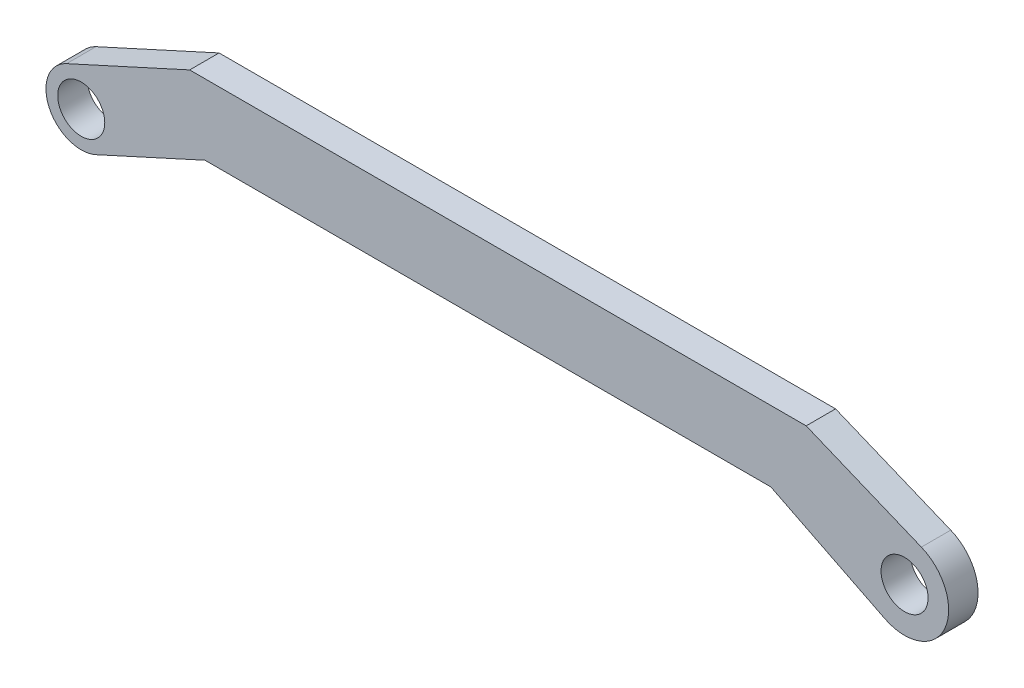
ISO-10303-21;
HEADER;
FILE_DESCRIPTION(('STEP AP214'),'2;1');
FILE_NAME('part.step','',(''),(''),'','','');
FILE_SCHEMA(('AUTOMOTIVE_DESIGN { 1 0 10303 214 1 1 1 1 }'));
ENDSEC;
DATA;
#1=APPLICATION_CONTEXT('core data for automotive mechanical design processes');
#2=APPLICATION_PROTOCOL_DEFINITION('international standard','automotive_design',2000,#1);
#3=PRODUCT_CONTEXT('',#1,'mechanical');
#4=PRODUCT('Part','Part','',(#3));
#5=PRODUCT_RELATED_PRODUCT_CATEGORY('part','',(#4));
#6=PRODUCT_DEFINITION_FORMATION('','',#4);
#7=PRODUCT_DEFINITION_CONTEXT('part definition',#1,'design');
#8=PRODUCT_DEFINITION('design','',#6,#7);
#9=PRODUCT_DEFINITION_SHAPE('','',#8);
#10=(LENGTH_UNIT() NAMED_UNIT(*) SI_UNIT(.MILLI.,.METRE.));
#11=(NAMED_UNIT(*) PLANE_ANGLE_UNIT() SI_UNIT($,.RADIAN.));
#12=(NAMED_UNIT(*) SI_UNIT($,.STERADIAN.) SOLID_ANGLE_UNIT());
#13=UNCERTAINTY_MEASURE_WITH_UNIT(LENGTH_MEASURE(1.E-05),#10,'distance_accuracy_value','');
#14=(GEOMETRIC_REPRESENTATION_CONTEXT(3) GLOBAL_UNCERTAINTY_ASSIGNED_CONTEXT((#13)) GLOBAL_UNIT_ASSIGNED_CONTEXT((#10,
#11,#12)) REPRESENTATION_CONTEXT('',''));
#15=CARTESIAN_POINT('',(0.,0.,0.));
#16=DIRECTION('',(0.,0.,1.));
#17=DIRECTION('',(1.,0.,0.));
#18=AXIS2_PLACEMENT_3D('',#15,#16,#17);
#19=CARTESIAN_POINT('',(-2.48874202337485,5.45950209644507,5.));
#20=DIRECTION('',(0.414790337229141,-0.909917016074178,0.));
#21=DIRECTION('',(0.909917016074178,0.414790337229141,0.));
#22=AXIS2_PLACEMENT_3D('',#19,#20,#21);
#23=PLANE('',#22);
#24=DIRECTION('',(-0.909917016074178,-0.414790337229141,0.));
#25=VECTOR('',#24,1.);
#26=CARTESIAN_POINT('',(-2.48874202337485,5.45950209644507,0.));
#27=LINE('',#26,#25);
#28=CARTESIAN_POINT('',(18.4400516468331,15.,0.));
#29=VERTEX_POINT('',#28);
#30=CARTESIAN_POINT('',(-2.48874202337484,5.45950209644507,0.));
#31=VERTEX_POINT('',#30);
#32=EDGE_CURVE('E138',#29,#31,#27,.T.);
#33=ORIENTED_EDGE('',*,*,#32,.T.);
#34=DIRECTION('',(0.,0.,-1.));
#35=VECTOR('',#34,1.);
#36=CARTESIAN_POINT('',(-2.48874202337484,5.45950209644507,5.));
#37=LINE('',#36,#35);
#38=CARTESIAN_POINT('',(-2.48874202337484,5.45950209644507,5.));
#39=VERTEX_POINT('',#38);
#40=EDGE_CURVE('E11',#39,#31,#37,.T.);
#41=ORIENTED_EDGE('',*,*,#40,.F.);
#42=DIRECTION('',(-0.909917016074178,-0.414790337229141,0.));
#43=VECTOR('',#42,1.);
#44=CARTESIAN_POINT('',(-2.48874202337485,5.45950209644507,5.));
#45=LINE('',#44,#43);
#46=CARTESIAN_POINT('',(18.4400516468331,15.,5.));
#47=VERTEX_POINT('',#46);
#48=EDGE_CURVE('E187',#47,#39,#45,.T.);
#49=ORIENTED_EDGE('',*,*,#48,.F.);
#50=DIRECTION('',(0.,0.,-1.));
#51=VECTOR('',#50,1.);
#52=CARTESIAN_POINT('',(18.4400516468331,15.,5.));
#53=LINE('',#52,#51);
#54=EDGE_CURVE('E51',#47,#29,#53,.T.);
#55=ORIENTED_EDGE('',*,*,#54,.T.);
#56=EDGE_LOOP('',(#33,#41,#49,#55));
#57=FACE_BOUND('',#56,.T.);
#58=ADVANCED_FACE('F34',(#57),#23,.F.);
#59=CARTESIAN_POINT('',(0.,0.,5.));
#60=DIRECTION('',(0.,0.,-1.));
#61=DIRECTION('',(-1.,0.,0.));
#62=AXIS2_PLACEMENT_3D('',#59,#60,#61);
#63=CYLINDRICAL_SURFACE('',#62,6.);
#64=CARTESIAN_POINT('',(0.,0.,0.));
#65=DIRECTION('',(0.,0.,1.));
#66=DIRECTION('',(1.,0.,0.));
#67=AXIS2_PLACEMENT_3D('',#64,#65,#66);
#68=CIRCLE('',#67,6.);
#69=CARTESIAN_POINT('',(2.48874202337485,-5.45950209644506,0.));
#70=VERTEX_POINT('',#69);
#71=EDGE_CURVE('E140',#31,#70,#68,.T.);
#72=ORIENTED_EDGE('',*,*,#71,.T.);
#73=DIRECTION('',(0.,0.,-1.));
#74=VECTOR('',#73,1.);
#75=CARTESIAN_POINT('',(2.48874202337485,-5.45950209644506,5.));
#76=LINE('',#75,#74);
#77=CARTESIAN_POINT('',(2.48874202337485,-5.45950209644506,5.));
#78=VERTEX_POINT('',#77);
#79=EDGE_CURVE('E43',#78,#70,#76,.T.);
#80=ORIENTED_EDGE('',*,*,#79,.F.);
#81=CARTESIAN_POINT('',(0.,0.,5.));
#82=DIRECTION('',(0.,0.,1.));
#83=DIRECTION('',(1.,0.,0.));
#84=AXIS2_PLACEMENT_3D('',#81,#82,#83);
#85=CIRCLE('',#84,6.);
#86=EDGE_CURVE('E89',#39,#78,#85,.T.);
#87=ORIENTED_EDGE('',*,*,#86,.F.);
#88=ORIENTED_EDGE('',*,*,#40,.T.);
#89=EDGE_LOOP('',(#72,#80,#87,#88));
#90=FACE_BOUND('',#89,.T.);
#91=ADVANCED_FACE('F170',(#90),#63,.T.);
#92=CARTESIAN_POINT('',(2.48874202337484,-5.45950209644506,5.));
#93=DIRECTION('',(0.414790337229141,-0.909917016074178,0.));
#94=DIRECTION('',(0.909917016074178,0.414790337229141,0.));
#95=AXIS2_PLACEMENT_3D('',#92,#93,#94);
#96=PLANE('',#95);
#97=DIRECTION('',(-0.909917016074178,-0.414790337229141,0.));
#98=VECTOR('',#97,1.);
#99=CARTESIAN_POINT('',(2.48874202337484,-5.45950209644506,0.));
#100=LINE('',#99,#98);
#101=CARTESIAN_POINT('',(21.0461774653154,3.,0.));
#102=VERTEX_POINT('',#101);
#103=EDGE_CURVE('E143',#102,#70,#100,.T.);
#104=ORIENTED_EDGE('',*,*,#103,.F.);
#105=DIRECTION('',(0.,0.,-1.));
#106=VECTOR('',#105,1.);
#107=CARTESIAN_POINT('',(21.0461774653154,3.,5.));
#108=LINE('',#107,#106);
#109=CARTESIAN_POINT('',(21.0461774653154,3.,5.));
#110=VERTEX_POINT('',#109);
#111=EDGE_CURVE('E163',#110,#102,#108,.T.);
#112=ORIENTED_EDGE('',*,*,#111,.F.);
#113=DIRECTION('',(-0.909917016074178,-0.414790337229141,0.));
#114=VECTOR('',#113,1.);
#115=CARTESIAN_POINT('',(2.48874202337484,-5.45950209644506,5.));
#116=LINE('',#115,#114);
#117=EDGE_CURVE('E169',#110,#78,#116,.T.);
#118=ORIENTED_EDGE('',*,*,#117,.T.);
#119=ORIENTED_EDGE('',*,*,#79,.T.);
#120=EDGE_LOOP('',(#104,#112,#118,#119));
#121=FACE_BOUND('',#120,.T.);
#122=ADVANCED_FACE('F167',(#121),#96,.T.);
#123=CARTESIAN_POINT('',(0.,3.,5.));
#124=DIRECTION('',(0.,1.,0.));
#125=DIRECTION('',(0.,0.,1.));
#126=AXIS2_PLACEMENT_3D('',#123,#124,#125);
#127=PLANE('',#126);
#128=DIRECTION('',(1.,0.,0.));
#129=VECTOR('',#128,1.);
#130=CARTESIAN_POINT('',(0.,3.,0.));
#131=LINE('',#130,#129);
#132=CARTESIAN_POINT('',(117.260230362543,2.99999999999999,0.));
#133=VERTEX_POINT('',#132);
#134=EDGE_CURVE('E146',#102,#133,#131,.T.);
#135=ORIENTED_EDGE('',*,*,#134,.T.);
#136=DIRECTION('',(0.,0.,-1.));
#137=VECTOR('',#136,1.);
#138=CARTESIAN_POINT('',(117.260230362543,2.99999999999999,5.));
#139=LINE('',#138,#137);
#140=CARTESIAN_POINT('',(117.260230362543,2.99999999999999,5.));
#141=VERTEX_POINT('',#140);
#142=EDGE_CURVE('E160',#141,#133,#139,.T.);
#143=ORIENTED_EDGE('',*,*,#142,.F.);
#144=DIRECTION('',(1.,0.,0.));
#145=VECTOR('',#144,1.);
#146=CARTESIAN_POINT('',(0.,3.,5.));
#147=LINE('',#146,#145);
#148=EDGE_CURVE('E182',#110,#141,#147,.T.);
#149=ORIENTED_EDGE('',*,*,#148,.F.);
#150=ORIENTED_EDGE('',*,*,#111,.T.);
#151=EDGE_LOOP('',(#135,#143,#149,#150));
#152=FACE_BOUND('',#151,.T.);
#153=ADVANCED_FACE('F178',(#152),#127,.F.);
#154=CARTESIAN_POINT('',(24.7127038317791,49.3471484366467,5.));
#155=DIRECTION('',(0.447780711374673,0.894143408252162,0.));
#156=DIRECTION('',(-0.894143408252162,0.447780711374673,0.));
#157=AXIS2_PLACEMENT_3D('',#154,#155,#156);
#158=PLANE('',#157);
#159=DIRECTION('',(0.894143408252162,-0.447780711374673,0.));
#160=VECTOR('',#159,1.);
#161=CARTESIAN_POINT('',(24.7127038317791,49.3471484366467,0.));
#162=LINE('',#161,#160);
#163=CARTESIAN_POINT('',(136.64164466469,-6.70607556189121,0.));
#164=VERTEX_POINT('',#163);
#165=EDGE_CURVE('E148',#133,#164,#162,.T.);
#166=ORIENTED_EDGE('',*,*,#165,.T.);
#167=DIRECTION('',(0.,0.,-1.));
#168=VECTOR('',#167,1.);
#169=CARTESIAN_POINT('',(136.64164466469,-6.70607556189121,5.));
#170=LINE('',#169,#168);
#171=CARTESIAN_POINT('',(136.64164466469,-6.70607556189121,5.));
#172=VERTEX_POINT('',#171);
#173=EDGE_CURVE('E124',#172,#164,#170,.T.);
#174=ORIENTED_EDGE('',*,*,#173,.F.);
#175=DIRECTION('',(0.894143408252162,-0.447780711374673,0.));
#176=VECTOR('',#175,1.);
#177=CARTESIAN_POINT('',(24.7127038317791,49.3471484366467,5.));
#178=LINE('',#177,#176);
#179=EDGE_CURVE('E112',#141,#172,#178,.T.);
#180=ORIENTED_EDGE('',*,*,#179,.F.);
#181=ORIENTED_EDGE('',*,*,#142,.T.);
#182=EDGE_LOOP('',(#166,#174,#180,#181));
#183=FACE_BOUND('',#182,.T.);
#184=ADVANCED_FACE('F181',(#183),#158,.F.);
#185=CARTESIAN_POINT('',(140.,0.,5.));
#186=DIRECTION('',(0.,0.,-1.));
#187=DIRECTION('',(-1.,0.,0.));
#188=AXIS2_PLACEMENT_3D('',#185,#186,#187);
#189=CYLINDRICAL_SURFACE('',#188,7.5);
#190=CARTESIAN_POINT('',(140.,0.,0.));
#191=DIRECTION('',(0.,0.,1.));
#192=DIRECTION('',(1.,0.,0.));
#193=AXIS2_PLACEMENT_3D('',#190,#191,#192);
#194=CIRCLE('',#193,7.5);
#195=CARTESIAN_POINT('',(142.855666239138,6.93506815616458,0.));
#196=VERTEX_POINT('',#195);
#197=EDGE_CURVE('E121',#164,#196,#194,.T.);
#198=ORIENTED_EDGE('',*,*,#197,.T.);
#199=DIRECTION('',(0.,0.,-1.));
#200=VECTOR('',#199,1.);
#201=CARTESIAN_POINT('',(142.855666239138,6.93506815616458,5.));
#202=LINE('',#201,#200);
#203=CARTESIAN_POINT('',(142.855666239138,6.93506815616458,5.));
#204=VERTEX_POINT('',#203);
#205=EDGE_CURVE('E118',#204,#196,#202,.T.);
#206=ORIENTED_EDGE('',*,*,#205,.F.);
#207=CARTESIAN_POINT('',(140.,0.,5.));
#208=DIRECTION('',(0.,0.,1.));
#209=DIRECTION('',(1.,0.,0.));
#210=AXIS2_PLACEMENT_3D('',#207,#208,#209);
#211=CIRCLE('',#210,7.5);
#212=EDGE_CURVE('E105',#172,#204,#211,.T.);
#213=ORIENTED_EDGE('',*,*,#212,.F.);
#214=ORIENTED_EDGE('',*,*,#173,.T.);
#215=EDGE_LOOP('',(#198,#206,#213,#214));
#216=FACE_BOUND('',#215,.T.);
#217=ADVANCED_FACE('F119',(#216),#189,.T.);
#218=CARTESIAN_POINT('',(23.1521311939702,56.2256210442564,5.));
#219=DIRECTION('',(0.380755498551726,0.924675754155275,0.));
#220=DIRECTION('',(-0.924675754155275,0.380755498551726,0.));
#221=AXIS2_PLACEMENT_3D('',#218,#219,#220);
#222=PLANE('',#221);
#223=DIRECTION('',(0.924675754155275,-0.380755498551726,0.));
#224=VECTOR('',#223,1.);
#225=CARTESIAN_POINT('',(23.1521311939702,56.2256210442564,0.));
#226=LINE('',#225,#224);
#227=CARTESIAN_POINT('',(123.269745711988,15.,0.));
#228=VERTEX_POINT('',#227);
#229=EDGE_CURVE('E151',#228,#196,#226,.T.);
#230=ORIENTED_EDGE('',*,*,#229,.F.);
#231=DIRECTION('',(0.,0.,-1.));
#232=VECTOR('',#231,1.);
#233=CARTESIAN_POINT('',(123.269745711988,15.,5.));
#234=LINE('',#233,#232);
#235=CARTESIAN_POINT('',(123.269745711988,15.,5.));
#236=VERTEX_POINT('',#235);
#237=EDGE_CURVE('E77',#236,#228,#234,.T.);
#238=ORIENTED_EDGE('',*,*,#237,.F.);
#239=DIRECTION('',(0.924675754155275,-0.380755498551726,0.));
#240=VECTOR('',#239,1.);
#241=CARTESIAN_POINT('',(23.1521311939702,56.2256210442564,5.));
#242=LINE('',#241,#240);
#243=EDGE_CURVE('E110',#236,#204,#242,.T.);
#244=ORIENTED_EDGE('',*,*,#243,.T.);
#245=ORIENTED_EDGE('',*,*,#205,.T.);
#246=EDGE_LOOP('',(#230,#238,#244,#245));
#247=FACE_BOUND('',#246,.T.);
#248=ADVANCED_FACE('F126',(#247),#222,.T.);
#249=CARTESIAN_POINT('',(140.,0.,5.));
#250=DIRECTION('',(0.,0.,-1.));
#251=DIRECTION('',(-1.,0.,0.));
#252=AXIS2_PLACEMENT_3D('',#249,#250,#251);
#253=CYLINDRICAL_SURFACE('',#252,3.99999999999999);
#254=CARTESIAN_POINT('',(140.,0.,5.));
#255=DIRECTION('',(0.,0.,1.));
#256=DIRECTION('',(1.,0.,0.));
#257=AXIS2_PLACEMENT_3D('',#254,#255,#256);
#258=CIRCLE('',#257,3.99999999999999);
#259=CARTESIAN_POINT('',(144.,0.,5.));
#260=VERTEX_POINT('',#259);
#261=EDGE_CURVE('E189',#260,#260,#258,.T.);
#262=ORIENTED_EDGE('',*,*,#261,.T.);
#263=EDGE_LOOP('',(#262));
#264=FACE_BOUND('',#263,.T.);
#265=CARTESIAN_POINT('',(140.,0.,0.));
#266=DIRECTION('',(0.,0.,1.));
#267=DIRECTION('',(1.,0.,0.));
#268=AXIS2_PLACEMENT_3D('',#265,#266,#267);
#269=CIRCLE('',#268,3.99999999999999);
#270=CARTESIAN_POINT('',(144.,0.,0.));
#271=VERTEX_POINT('',#270);
#272=EDGE_CURVE('E135',#271,#271,#269,.T.);
#273=ORIENTED_EDGE('',*,*,#272,.F.);
#274=EDGE_LOOP('',(#273));
#275=FACE_BOUND('',#274,.T.);
#276=ADVANCED_FACE('F203',(#264,#275),#253,.F.);
#277=CARTESIAN_POINT('',(0.,0.,5.));
#278=DIRECTION('',(0.,0.,-1.));
#279=DIRECTION('',(-1.,0.,0.));
#280=AXIS2_PLACEMENT_3D('',#277,#278,#279);
#281=CYLINDRICAL_SURFACE('',#280,4.);
#282=CARTESIAN_POINT('',(0.,0.,5.));
#283=DIRECTION('',(0.,0.,1.));
#284=DIRECTION('',(1.,0.,0.));
#285=AXIS2_PLACEMENT_3D('',#282,#283,#284);
#286=CIRCLE('',#285,4.);
#287=CARTESIAN_POINT('',(4.,0.,5.));
#288=VERTEX_POINT('',#287);
#289=EDGE_CURVE('E156',#288,#288,#286,.T.);
#290=ORIENTED_EDGE('',*,*,#289,.T.);
#291=EDGE_LOOP('',(#290));
#292=FACE_BOUND('',#291,.T.);
#293=CARTESIAN_POINT('',(0.,0.,0.));
#294=DIRECTION('',(0.,0.,1.));
#295=DIRECTION('',(1.,0.,0.));
#296=AXIS2_PLACEMENT_3D('',#293,#294,#295);
#297=CIRCLE('',#296,4.);
#298=CARTESIAN_POINT('',(4.,0.,0.));
#299=VERTEX_POINT('',#298);
#300=EDGE_CURVE('E132',#299,#299,#297,.T.);
#301=ORIENTED_EDGE('',*,*,#300,.F.);
#302=EDGE_LOOP('',(#301));
#303=FACE_BOUND('',#302,.T.);
#304=ADVANCED_FACE('F36',(#292,#303),#281,.F.);
#305=CARTESIAN_POINT('',(0.,15.,5.));
#306=DIRECTION('',(0.,1.,0.));
#307=DIRECTION('',(-1.,0.,0.));
#308=AXIS2_PLACEMENT_3D('',#305,#306,#307);
#309=PLANE('',#308);
#310=DIRECTION('',(1.,0.,0.));
#311=VECTOR('',#310,1.);
#312=CARTESIAN_POINT('',(0.,15.,0.));
#313=LINE('',#312,#311);
#314=EDGE_CURVE('E153',#29,#228,#313,.T.);
#315=ORIENTED_EDGE('',*,*,#314,.F.);
#316=ORIENTED_EDGE('',*,*,#54,.F.);
#317=DIRECTION('',(1.,0.,0.));
#318=VECTOR('',#317,1.);
#319=CARTESIAN_POINT('',(0.,15.,5.));
#320=LINE('',#319,#318);
#321=EDGE_CURVE('E127',#47,#236,#320,.T.);
#322=ORIENTED_EDGE('',*,*,#321,.T.);
#323=ORIENTED_EDGE('',*,*,#237,.T.);
#324=EDGE_LOOP('',(#315,#316,#322,#323));
#325=FACE_BOUND('',#324,.T.);
#326=ADVANCED_FACE('F199',(#325),#309,.T.);
#327=CARTESIAN_POINT('',(0.,0.,5.));
#328=DIRECTION('',(0.,0.,1.));
#329=DIRECTION('',(1.,0.,0.));
#330=AXIS2_PLACEMENT_3D('',#327,#328,#329);
#331=PLANE('',#330);
#332=ORIENTED_EDGE('',*,*,#289,.F.);
#333=EDGE_LOOP('',(#332));
#334=FACE_BOUND('',#333,.T.);
#335=ORIENTED_EDGE('',*,*,#261,.F.);
#336=EDGE_LOOP('',(#335));
#337=FACE_BOUND('',#336,.T.);
#338=ORIENTED_EDGE('',*,*,#48,.T.);
#339=ORIENTED_EDGE('',*,*,#86,.T.);
#340=ORIENTED_EDGE('',*,*,#117,.F.);
#341=ORIENTED_EDGE('',*,*,#148,.T.);
#342=ORIENTED_EDGE('',*,*,#179,.T.);
#343=ORIENTED_EDGE('',*,*,#212,.T.);
#344=ORIENTED_EDGE('',*,*,#243,.F.);
#345=ORIENTED_EDGE('',*,*,#321,.F.);
#346=EDGE_LOOP('',(#338,#339,#340,#341,#342,#343,#344,#345));
#347=FACE_BOUND('',#346,.T.);
#348=ADVANCED_FACE('F107',(#334,#337,#347),#331,.T.);
#349=CARTESIAN_POINT('',(0.,0.,0.));
#350=DIRECTION('',(0.,0.,1.));
#351=DIRECTION('',(1.,0.,0.));
#352=AXIS2_PLACEMENT_3D('',#349,#350,#351);
#353=PLANE('',#352);
#354=ORIENTED_EDGE('',*,*,#300,.T.);
#355=EDGE_LOOP('',(#354));
#356=FACE_BOUND('',#355,.T.);
#357=ORIENTED_EDGE('',*,*,#272,.T.);
#358=EDGE_LOOP('',(#357));
#359=FACE_BOUND('',#358,.T.);
#360=ORIENTED_EDGE('',*,*,#32,.F.);
#361=ORIENTED_EDGE('',*,*,#314,.T.);
#362=ORIENTED_EDGE('',*,*,#229,.T.);
#363=ORIENTED_EDGE('',*,*,#197,.F.);
#364=ORIENTED_EDGE('',*,*,#165,.F.);
#365=ORIENTED_EDGE('',*,*,#134,.F.);
#366=ORIENTED_EDGE('',*,*,#103,.T.);
#367=ORIENTED_EDGE('',*,*,#71,.F.);
#368=EDGE_LOOP('',(#360,#361,#362,#363,#364,#365,#366,#367));
#369=FACE_BOUND('',#368,.T.);
#370=ADVANCED_FACE('F174',(#356,#359,#369),#353,.F.);
#371=CLOSED_SHELL('',(#58,#91,#122,#153,#184,#217,#248,#276,#304,#326,#348,#370));
#372=MANIFOLD_SOLID_BREP('B2',#371);
#373=ADVANCED_BREP_SHAPE_REPRESENTATION('',(#18,#372),#14);
#374=SHAPE_DEFINITION_REPRESENTATION(#9,#373);
ENDSEC;
END-ISO-10303-21;
